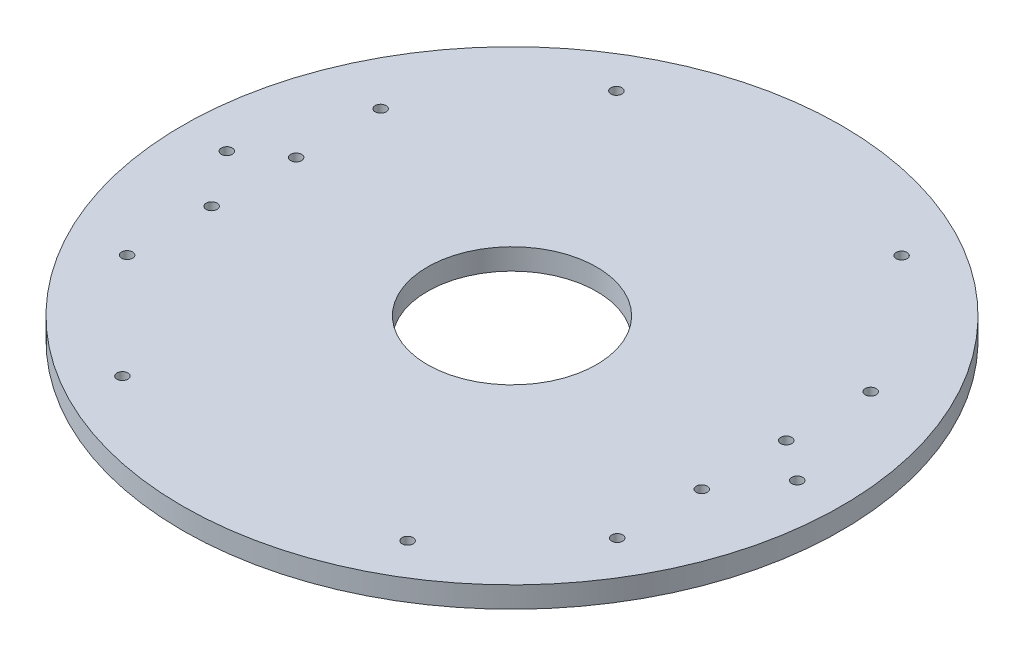
ISO-10303-21;
HEADER;
FILE_DESCRIPTION(('STEP AP214'),'2;1');
FILE_NAME('part.step','',(''),(''),'','','');
FILE_SCHEMA(('AUTOMOTIVE_DESIGN { 1 0 10303 214 1 1 1 1 }'));
ENDSEC;
DATA;
#1=APPLICATION_CONTEXT('core data for automotive mechanical design processes');
#2=APPLICATION_PROTOCOL_DEFINITION('international standard','automotive_design',2000,#1);
#3=PRODUCT_CONTEXT('',#1,'mechanical');
#4=PRODUCT('Part','Part','',(#3));
#5=PRODUCT_RELATED_PRODUCT_CATEGORY('part','',(#4));
#6=PRODUCT_DEFINITION_FORMATION('','',#4);
#7=PRODUCT_DEFINITION_CONTEXT('part definition',#1,'design');
#8=PRODUCT_DEFINITION('design','',#6,#7);
#9=PRODUCT_DEFINITION_SHAPE('','',#8);
#10=(LENGTH_UNIT() NAMED_UNIT(*) SI_UNIT(.MILLI.,.METRE.));
#11=(NAMED_UNIT(*) PLANE_ANGLE_UNIT() SI_UNIT($,.RADIAN.));
#12=(NAMED_UNIT(*) SI_UNIT($,.STERADIAN.) SOLID_ANGLE_UNIT());
#13=UNCERTAINTY_MEASURE_WITH_UNIT(LENGTH_MEASURE(1.E-05),#10,'distance_accuracy_value','');
#14=(GEOMETRIC_REPRESENTATION_CONTEXT(3) GLOBAL_UNCERTAINTY_ASSIGNED_CONTEXT((#13)) GLOBAL_UNIT_ASSIGNED_CONTEXT((#10,
#11,#12)) REPRESENTATION_CONTEXT('',''));
#15=CARTESIAN_POINT('',(0.,0.,0.));
#16=DIRECTION('',(0.,0.,1.));
#17=DIRECTION('',(1.,0.,0.));
#18=AXIS2_PLACEMENT_3D('',#15,#16,#17);
#19=CARTESIAN_POINT('',(0.,10.,0.));
#20=DIRECTION('',(0.,1.,0.));
#21=DIRECTION('',(0.,0.,1.));
#22=AXIS2_PLACEMENT_3D('',#19,#20,#21);
#23=PLANE('',#22);
#24=CARTESIAN_POINT('',(-67.5000000000013,10.,-116.913429510898));
#25=DIRECTION('',(0.,1.,0.));
#26=DIRECTION('',(-0.866025403784433,0.,0.50000000000001));
#27=AXIS2_PLACEMENT_3D('',#24,#25,#26);
#28=CIRCLE('',#27,2.59999999999999);
#29=CARTESIAN_POINT('',(-69.7516660498408,10.,-115.613429510898));
#30=VERTEX_POINT('',#29);
#31=EDGE_CURVE('E140',#30,#30,#28,.T.);
#32=ORIENTED_EDGE('',*,*,#31,.F.);
#33=EDGE_LOOP('',(#32));
#34=FACE_BOUND('',#33,.T.);
#35=CARTESIAN_POINT('',(67.4999999999988,10.,-116.9134295109));
#36=DIRECTION('',(0.,1.,0.));
#37=DIRECTION('',(-0.866025403784443,0.,-0.499999999999992));
#38=AXIS2_PLACEMENT_3D('',#35,#36,#37);
#39=CIRCLE('',#38,2.59999999999999);
#40=CARTESIAN_POINT('',(65.2483339501593,10.,-118.2134295109));
#41=VERTEX_POINT('',#40);
#42=EDGE_CURVE('E148',#41,#41,#39,.T.);
#43=ORIENTED_EDGE('',*,*,#42,.F.);
#44=EDGE_LOOP('',(#43));
#45=FACE_BOUND('',#44,.T.);
#46=CARTESIAN_POINT('',(135.,10.,0.));
#47=DIRECTION('',(0.,1.,0.));
#48=DIRECTION('',(0.,0.,-1.));
#49=AXIS2_PLACEMENT_3D('',#46,#47,#48);
#50=CIRCLE('',#49,2.59999999999999);
#51=CARTESIAN_POINT('',(135.,10.,-2.59999999999999));
#52=VERTEX_POINT('',#51);
#53=EDGE_CURVE('E156',#52,#52,#50,.T.);
#54=ORIENTED_EDGE('',*,*,#53,.F.);
#55=EDGE_LOOP('',(#54));
#56=FACE_BOUND('',#55,.T.);
#57=CARTESIAN_POINT('',(67.5000000000005,10.,116.913429510899));
#58=DIRECTION('',(0.,1.,0.));
#59=DIRECTION('',(0.866025403784436,0.,-0.500000000000004));
#60=AXIS2_PLACEMENT_3D('',#57,#58,#59);
#61=CIRCLE('',#60,2.59999999999999);
#62=CARTESIAN_POINT('',(69.75166604984,10.,115.613429510899));
#63=VERTEX_POINT('',#62);
#64=EDGE_CURVE('E164',#63,#63,#61,.T.);
#65=ORIENTED_EDGE('',*,*,#64,.F.);
#66=EDGE_LOOP('',(#65));
#67=FACE_BOUND('',#66,.T.);
#68=CARTESIAN_POINT('',(-67.4999999999996,10.,116.913429510899));
#69=DIRECTION('',(0.,1.,0.));
#70=DIRECTION('',(0.86602540378444,0.,0.499999999999998));
#71=AXIS2_PLACEMENT_3D('',#68,#69,#70);
#72=CIRCLE('',#71,2.59999999999999);
#73=CARTESIAN_POINT('',(-65.2483339501601,10.,118.213429510899));
#74=VERTEX_POINT('',#73);
#75=EDGE_CURVE('E132',#74,#74,#72,.T.);
#76=ORIENTED_EDGE('',*,*,#75,.F.);
#77=EDGE_LOOP('',(#76));
#78=FACE_BOUND('',#77,.T.);
#79=CARTESIAN_POINT('',(-135.,10.,0.));
#80=DIRECTION('',(0.,1.,0.));
#81=DIRECTION('',(0.,0.,1.));
#82=AXIS2_PLACEMENT_3D('',#79,#80,#81);
#83=CIRCLE('',#82,2.59999999999999);
#84=CARTESIAN_POINT('',(-135.,10.,2.59999999999999));
#85=VERTEX_POINT('',#84);
#86=EDGE_CURVE('E124',#85,#85,#83,.T.);
#87=ORIENTED_EDGE('',*,*,#86,.F.);
#88=EDGE_LOOP('',(#87));
#89=FACE_BOUND('',#88,.T.);
#90=CARTESIAN_POINT('',(0.,10.,0.));
#91=DIRECTION('',(0.,1.,0.));
#92=DIRECTION('',(0.,0.,1.));
#93=AXIS2_PLACEMENT_3D('',#90,#91,#92);
#94=CIRCLE('',#93,40.05);
#95=CARTESIAN_POINT('',(0.,10.,40.05));
#96=VERTEX_POINT('',#95);
#97=EDGE_CURVE('E116',#96,#96,#94,.T.);
#98=ORIENTED_EDGE('',*,*,#97,.F.);
#99=EDGE_LOOP('',(#98));
#100=FACE_BOUND('',#99,.T.);
#101=CARTESIAN_POINT('',(116.,10.,66.2));
#102=DIRECTION('',(0.,1.,0.));
#103=DIRECTION('',(0.,0.,1.));
#104=AXIS2_PLACEMENT_3D('',#101,#102,#103);
#105=CIRCLE('',#104,2.6);
#106=CARTESIAN_POINT('',(116.,10.,68.8));
#107=VERTEX_POINT('',#106);
#108=EDGE_CURVE('E56',#107,#107,#105,.T.);
#109=ORIENTED_EDGE('',*,*,#108,.F.);
#110=EDGE_LOOP('',(#109));
#111=FACE_BOUND('',#110,.T.);
#112=CARTESIAN_POINT('',(116.,10.,-13.8));
#113=DIRECTION('',(0.,1.,0.));
#114=DIRECTION('',(0.,0.,1.));
#115=AXIS2_PLACEMENT_3D('',#112,#113,#114);
#116=CIRCLE('',#115,2.60000000000006);
#117=CARTESIAN_POINT('',(116.,10.,-11.1999999999999));
#118=VERTEX_POINT('',#117);
#119=EDGE_CURVE('E81',#118,#118,#116,.T.);
#120=ORIENTED_EDGE('',*,*,#119,.F.);
#121=EDGE_LOOP('',(#120));
#122=FACE_BOUND('',#121,.T.);
#123=CARTESIAN_POINT('',(116.,10.,-53.8));
#124=DIRECTION('',(0.,1.,0.));
#125=DIRECTION('',(0.,0.,1.));
#126=AXIS2_PLACEMENT_3D('',#123,#124,#125);
#127=CIRCLE('',#126,2.6);
#128=CARTESIAN_POINT('',(116.,10.,-51.2));
#129=VERTEX_POINT('',#128);
#130=EDGE_CURVE('E73',#129,#129,#127,.T.);
#131=ORIENTED_EDGE('',*,*,#130,.F.);
#132=EDGE_LOOP('',(#131));
#133=FACE_BOUND('',#132,.T.);
#134=CARTESIAN_POINT('',(-116.,10.,-13.8));
#135=DIRECTION('',(0.,-1.,0.));
#136=DIRECTION('',(0.,0.,-1.));
#137=AXIS2_PLACEMENT_3D('',#134,#135,#136);
#138=CIRCLE('',#137,2.6);
#139=CARTESIAN_POINT('',(-116.,10.,-16.4));
#140=VERTEX_POINT('',#139);
#141=EDGE_CURVE('E65',#140,#140,#138,.T.);
#142=ORIENTED_EDGE('',*,*,#141,.T.);
#143=EDGE_LOOP('',(#142));
#144=FACE_BOUND('',#143,.T.);
#145=CARTESIAN_POINT('',(-116.,10.,66.2));
#146=DIRECTION('',(0.,-1.,0.));
#147=DIRECTION('',(0.,0.,-1.));
#148=AXIS2_PLACEMENT_3D('',#145,#146,#147);
#149=CIRCLE('',#148,2.6);
#150=CARTESIAN_POINT('',(-116.,10.,63.6));
#151=VERTEX_POINT('',#150);
#152=EDGE_CURVE('E96',#151,#151,#149,.T.);
#153=ORIENTED_EDGE('',*,*,#152,.T.);
#154=EDGE_LOOP('',(#153));
#155=FACE_BOUND('',#154,.T.);
#156=CARTESIAN_POINT('',(116.,10.,26.2));
#157=DIRECTION('',(0.,1.,0.));
#158=DIRECTION('',(0.,0.,1.));
#159=AXIS2_PLACEMENT_3D('',#156,#157,#158);
#160=CIRCLE('',#159,2.6);
#161=CARTESIAN_POINT('',(116.,10.,28.8));
#162=VERTEX_POINT('',#161);
#163=EDGE_CURVE('E52',#162,#162,#160,.T.);
#164=ORIENTED_EDGE('',*,*,#163,.F.);
#165=EDGE_LOOP('',(#164));
#166=FACE_BOUND('',#165,.T.);
#167=CARTESIAN_POINT('',(0.,10.,0.));
#168=DIRECTION('',(0.,1.,0.));
#169=DIRECTION('',(0.,0.,1.));
#170=AXIS2_PLACEMENT_3D('',#167,#168,#169);
#171=CIRCLE('',#170,156.);
#172=CARTESIAN_POINT('',(0.,10.,156.));
#173=VERTEX_POINT('',#172);
#174=EDGE_CURVE('E10',#173,#173,#171,.T.);
#175=ORIENTED_EDGE('',*,*,#174,.T.);
#176=EDGE_LOOP('',(#175));
#177=FACE_BOUND('',#176,.T.);
#178=CARTESIAN_POINT('',(-116.,10.,26.2));
#179=DIRECTION('',(0.,-1.,0.));
#180=DIRECTION('',(0.,0.,-1.));
#181=AXIS2_PLACEMENT_3D('',#178,#179,#180);
#182=CIRCLE('',#181,2.6);
#183=CARTESIAN_POINT('',(-116.,10.,23.6));
#184=VERTEX_POINT('',#183);
#185=EDGE_CURVE('E105',#184,#184,#182,.T.);
#186=ORIENTED_EDGE('',*,*,#185,.T.);
#187=EDGE_LOOP('',(#186));
#188=FACE_BOUND('',#187,.T.);
#189=CARTESIAN_POINT('',(-116.,10.,-53.8));
#190=DIRECTION('',(0.,-1.,0.));
#191=DIRECTION('',(0.,0.,-1.));
#192=AXIS2_PLACEMENT_3D('',#189,#190,#191);
#193=CIRCLE('',#192,2.6);
#194=CARTESIAN_POINT('',(-116.,10.,-56.4));
#195=VERTEX_POINT('',#194);
#196=EDGE_CURVE('E64',#195,#195,#193,.T.);
#197=ORIENTED_EDGE('',*,*,#196,.T.);
#198=EDGE_LOOP('',(#197));
#199=FACE_BOUND('',#198,.T.);
#200=ADVANCED_FACE('F37',(#34,#45,#56,#67,#78,#89,#100,#111,#122,#133,#144,#155,#166,#177,#188,
#199),#23,.T.);
#201=CARTESIAN_POINT('',(0.,0.,0.));
#202=DIRECTION('',(0.,1.,0.));
#203=DIRECTION('',(0.,0.,1.));
#204=AXIS2_PLACEMENT_3D('',#201,#202,#203);
#205=PLANE('',#204);
#206=CARTESIAN_POINT('',(-67.5000000000013,0.,-116.913429510898));
#207=DIRECTION('',(0.,1.,0.));
#208=DIRECTION('',(-0.866025403784433,0.,0.50000000000001));
#209=AXIS2_PLACEMENT_3D('',#206,#207,#208);
#210=CIRCLE('',#209,2.59999999999999);
#211=CARTESIAN_POINT('',(-69.7516660498408,0.,-115.613429510898));
#212=VERTEX_POINT('',#211);
#213=EDGE_CURVE('E144',#212,#212,#210,.T.);
#214=ORIENTED_EDGE('',*,*,#213,.T.);
#215=EDGE_LOOP('',(#214));
#216=FACE_BOUND('',#215,.T.);
#217=CARTESIAN_POINT('',(67.4999999999988,0.,-116.9134295109));
#218=DIRECTION('',(0.,1.,0.));
#219=DIRECTION('',(-0.866025403784443,0.,-0.499999999999992));
#220=AXIS2_PLACEMENT_3D('',#217,#218,#219);
#221=CIRCLE('',#220,2.59999999999999);
#222=CARTESIAN_POINT('',(65.2483339501593,0.,-118.2134295109));
#223=VERTEX_POINT('',#222);
#224=EDGE_CURVE('E152',#223,#223,#221,.T.);
#225=ORIENTED_EDGE('',*,*,#224,.T.);
#226=EDGE_LOOP('',(#225));
#227=FACE_BOUND('',#226,.T.);
#228=CARTESIAN_POINT('',(135.,0.,0.));
#229=DIRECTION('',(0.,1.,0.));
#230=DIRECTION('',(0.,0.,-1.));
#231=AXIS2_PLACEMENT_3D('',#228,#229,#230);
#232=CIRCLE('',#231,2.59999999999999);
#233=CARTESIAN_POINT('',(135.,0.,-2.59999999999999));
#234=VERTEX_POINT('',#233);
#235=EDGE_CURVE('E160',#234,#234,#232,.T.);
#236=ORIENTED_EDGE('',*,*,#235,.T.);
#237=EDGE_LOOP('',(#236));
#238=FACE_BOUND('',#237,.T.);
#239=CARTESIAN_POINT('',(67.5000000000005,0.,116.913429510899));
#240=DIRECTION('',(0.,1.,0.));
#241=DIRECTION('',(0.866025403784436,0.,-0.500000000000004));
#242=AXIS2_PLACEMENT_3D('',#239,#240,#241);
#243=CIRCLE('',#242,2.59999999999999);
#244=CARTESIAN_POINT('',(69.75166604984,0.,115.613429510899));
#245=VERTEX_POINT('',#244);
#246=EDGE_CURVE('E136',#245,#245,#243,.T.);
#247=ORIENTED_EDGE('',*,*,#246,.T.);
#248=EDGE_LOOP('',(#247));
#249=FACE_BOUND('',#248,.T.);
#250=CARTESIAN_POINT('',(-67.4999999999996,0.,116.913429510899));
#251=DIRECTION('',(0.,1.,0.));
#252=DIRECTION('',(0.86602540378444,0.,0.499999999999998));
#253=AXIS2_PLACEMENT_3D('',#250,#251,#252);
#254=CIRCLE('',#253,2.59999999999999);
#255=CARTESIAN_POINT('',(-65.2483339501601,0.,118.213429510899));
#256=VERTEX_POINT('',#255);
#257=EDGE_CURVE('E128',#256,#256,#254,.T.);
#258=ORIENTED_EDGE('',*,*,#257,.T.);
#259=EDGE_LOOP('',(#258));
#260=FACE_BOUND('',#259,.T.);
#261=CARTESIAN_POINT('',(-135.,0.,0.));
#262=DIRECTION('',(0.,1.,0.));
#263=DIRECTION('',(0.,0.,1.));
#264=AXIS2_PLACEMENT_3D('',#261,#262,#263);
#265=CIRCLE('',#264,2.59999999999999);
#266=CARTESIAN_POINT('',(-135.,0.,2.59999999999999));
#267=VERTEX_POINT('',#266);
#268=EDGE_CURVE('E120',#267,#267,#265,.T.);
#269=ORIENTED_EDGE('',*,*,#268,.T.);
#270=EDGE_LOOP('',(#269));
#271=FACE_BOUND('',#270,.T.);
#272=CARTESIAN_POINT('',(0.,0.,0.));
#273=DIRECTION('',(0.,1.,0.));
#274=DIRECTION('',(0.,0.,1.));
#275=AXIS2_PLACEMENT_3D('',#272,#273,#274);
#276=CIRCLE('',#275,40.05);
#277=CARTESIAN_POINT('',(0.,0.,40.05));
#278=VERTEX_POINT('',#277);
#279=EDGE_CURVE('E97',#278,#278,#276,.T.);
#280=ORIENTED_EDGE('',*,*,#279,.T.);
#281=EDGE_LOOP('',(#280));
#282=FACE_BOUND('',#281,.T.);
#283=CARTESIAN_POINT('',(116.,0.,66.2));
#284=DIRECTION('',(0.,1.,0.));
#285=DIRECTION('',(0.,0.,1.));
#286=AXIS2_PLACEMENT_3D('',#283,#284,#285);
#287=CIRCLE('',#286,2.6);
#288=CARTESIAN_POINT('',(116.,0.,68.8));
#289=VERTEX_POINT('',#288);
#290=EDGE_CURVE('E85',#289,#289,#287,.T.);
#291=ORIENTED_EDGE('',*,*,#290,.T.);
#292=EDGE_LOOP('',(#291));
#293=FACE_BOUND('',#292,.T.);
#294=CARTESIAN_POINT('',(116.,0.,-13.8));
#295=DIRECTION('',(0.,1.,0.));
#296=DIRECTION('',(0.,0.,1.));
#297=AXIS2_PLACEMENT_3D('',#294,#295,#296);
#298=CIRCLE('',#297,2.60000000000006);
#299=CARTESIAN_POINT('',(116.,0.,-11.1999999999999));
#300=VERTEX_POINT('',#299);
#301=EDGE_CURVE('E77',#300,#300,#298,.T.);
#302=ORIENTED_EDGE('',*,*,#301,.T.);
#303=EDGE_LOOP('',(#302));
#304=FACE_BOUND('',#303,.T.);
#305=CARTESIAN_POINT('',(116.,0.,-53.8));
#306=DIRECTION('',(0.,1.,0.));
#307=DIRECTION('',(0.,0.,1.));
#308=AXIS2_PLACEMENT_3D('',#305,#306,#307);
#309=CIRCLE('',#308,2.6);
#310=CARTESIAN_POINT('',(116.,0.,-51.2));
#311=VERTEX_POINT('',#310);
#312=EDGE_CURVE('E69',#311,#311,#309,.T.);
#313=ORIENTED_EDGE('',*,*,#312,.T.);
#314=EDGE_LOOP('',(#313));
#315=FACE_BOUND('',#314,.T.);
#316=CARTESIAN_POINT('',(116.,0.,26.2));
#317=DIRECTION('',(0.,1.,0.));
#318=DIRECTION('',(0.,0.,1.));
#319=AXIS2_PLACEMENT_3D('',#316,#317,#318);
#320=CIRCLE('',#319,2.6);
#321=CARTESIAN_POINT('',(116.,0.,28.8));
#322=VERTEX_POINT('',#321);
#323=EDGE_CURVE('E50',#322,#322,#320,.T.);
#324=ORIENTED_EDGE('',*,*,#323,.T.);
#325=EDGE_LOOP('',(#324));
#326=FACE_BOUND('',#325,.T.);
#327=CARTESIAN_POINT('',(0.,0.,0.));
#328=DIRECTION('',(0.,1.,0.));
#329=DIRECTION('',(0.,0.,1.));
#330=AXIS2_PLACEMENT_3D('',#327,#328,#329);
#331=CIRCLE('',#330,156.);
#332=CARTESIAN_POINT('',(0.,0.,156.));
#333=VERTEX_POINT('',#332);
#334=EDGE_CURVE('E41',#333,#333,#331,.T.);
#335=ORIENTED_EDGE('',*,*,#334,.F.);
#336=EDGE_LOOP('',(#335));
#337=FACE_BOUND('',#336,.T.);
#338=CARTESIAN_POINT('',(-116.,0.,66.2));
#339=DIRECTION('',(0.,-1.,0.));
#340=DIRECTION('',(0.,0.,-1.));
#341=AXIS2_PLACEMENT_3D('',#338,#339,#340);
#342=CIRCLE('',#341,2.6);
#343=CARTESIAN_POINT('',(-116.,0.,63.6));
#344=VERTEX_POINT('',#343);
#345=EDGE_CURVE('E92',#344,#344,#342,.T.);
#346=ORIENTED_EDGE('',*,*,#345,.F.);
#347=EDGE_LOOP('',(#346));
#348=FACE_BOUND('',#347,.T.);
#349=CARTESIAN_POINT('',(-116.,0.,26.2));
#350=DIRECTION('',(0.,-1.,0.));
#351=DIRECTION('',(0.,0.,-1.));
#352=AXIS2_PLACEMENT_3D('',#349,#350,#351);
#353=CIRCLE('',#352,2.6);
#354=CARTESIAN_POINT('',(-116.,0.,23.6));
#355=VERTEX_POINT('',#354);
#356=EDGE_CURVE('E101',#355,#355,#353,.T.);
#357=ORIENTED_EDGE('',*,*,#356,.F.);
#358=EDGE_LOOP('',(#357));
#359=FACE_BOUND('',#358,.T.);
#360=CARTESIAN_POINT('',(-116.,0.,-13.8));
#361=DIRECTION('',(0.,-1.,0.));
#362=DIRECTION('',(0.,0.,-1.));
#363=AXIS2_PLACEMENT_3D('',#360,#361,#362);
#364=CIRCLE('',#363,2.6);
#365=CARTESIAN_POINT('',(-116.,0.,-16.4));
#366=VERTEX_POINT('',#365);
#367=EDGE_CURVE('E109',#366,#366,#364,.T.);
#368=ORIENTED_EDGE('',*,*,#367,.F.);
#369=EDGE_LOOP('',(#368));
#370=FACE_BOUND('',#369,.T.);
#371=CARTESIAN_POINT('',(-116.,0.,-53.8));
#372=DIRECTION('',(0.,-1.,0.));
#373=DIRECTION('',(0.,0.,-1.));
#374=AXIS2_PLACEMENT_3D('',#371,#372,#373);
#375=CIRCLE('',#374,2.6);
#376=CARTESIAN_POINT('',(-116.,0.,-56.4));
#377=VERTEX_POINT('',#376);
#378=EDGE_CURVE('E60',#377,#377,#375,.T.);
#379=ORIENTED_EDGE('',*,*,#378,.F.);
#380=EDGE_LOOP('',(#379));
#381=FACE_BOUND('',#380,.T.);
#382=ADVANCED_FACE('F172',(#216,#227,#238,#249,#260,#271,#282,#293,#304,#315,#326,#337,#348,
#359,#370,#381),#205,.F.);
#383=CARTESIAN_POINT('',(0.,10.,0.));
#384=DIRECTION('',(0.,-1.,0.));
#385=DIRECTION('',(0.,0.,-1.));
#386=AXIS2_PLACEMENT_3D('',#383,#384,#385);
#387=CYLINDRICAL_SURFACE('',#386,156.);
#388=ORIENTED_EDGE('',*,*,#174,.F.);
#389=EDGE_LOOP('',(#388));
#390=FACE_BOUND('',#389,.T.);
#391=ORIENTED_EDGE('',*,*,#334,.T.);
#392=EDGE_LOOP('',(#391));
#393=FACE_BOUND('',#392,.T.);
#394=ADVANCED_FACE('F39',(#390,#393),#387,.T.);
#395=CARTESIAN_POINT('',(116.,0.,26.2));
#396=DIRECTION('',(0.,1.,0.));
#397=DIRECTION('',(0.,0.,1.));
#398=AXIS2_PLACEMENT_3D('',#395,#396,#397);
#399=CYLINDRICAL_SURFACE('',#398,2.6);
#400=ORIENTED_EDGE('',*,*,#323,.F.);
#401=EDGE_LOOP('',(#400));
#402=FACE_BOUND('',#401,.T.);
#403=ORIENTED_EDGE('',*,*,#163,.T.);
#404=EDGE_LOOP('',(#403));
#405=FACE_BOUND('',#404,.T.);
#406=ADVANCED_FACE('F227',(#402,#405),#399,.F.);
#407=CARTESIAN_POINT('',(-116.,0.,66.2));
#408=DIRECTION('',(0.,1.,0.));
#409=DIRECTION('',(0.,0.,1.));
#410=AXIS2_PLACEMENT_3D('',#407,#408,#409);
#411=CYLINDRICAL_SURFACE('',#410,2.6);
#412=ORIENTED_EDGE('',*,*,#345,.T.);
#413=EDGE_LOOP('',(#412));
#414=FACE_BOUND('',#413,.T.);
#415=ORIENTED_EDGE('',*,*,#152,.F.);
#416=EDGE_LOOP('',(#415));
#417=FACE_BOUND('',#416,.T.);
#418=ADVANCED_FACE('F229',(#414,#417),#411,.F.);
#419=CARTESIAN_POINT('',(-116.,0.,26.2));
#420=DIRECTION('',(0.,1.,0.));
#421=DIRECTION('',(0.,0.,1.));
#422=AXIS2_PLACEMENT_3D('',#419,#420,#421);
#423=CYLINDRICAL_SURFACE('',#422,2.6);
#424=ORIENTED_EDGE('',*,*,#356,.T.);
#425=EDGE_LOOP('',(#424));
#426=FACE_BOUND('',#425,.T.);
#427=ORIENTED_EDGE('',*,*,#185,.F.);
#428=EDGE_LOOP('',(#427));
#429=FACE_BOUND('',#428,.T.);
#430=ADVANCED_FACE('F222',(#426,#429),#423,.F.);
#431=CARTESIAN_POINT('',(-116.,0.,-13.8));
#432=DIRECTION('',(0.,1.,0.));
#433=DIRECTION('',(0.,0.,1.));
#434=AXIS2_PLACEMENT_3D('',#431,#432,#433);
#435=CYLINDRICAL_SURFACE('',#434,2.6);
#436=ORIENTED_EDGE('',*,*,#367,.T.);
#437=EDGE_LOOP('',(#436));
#438=FACE_BOUND('',#437,.T.);
#439=ORIENTED_EDGE('',*,*,#141,.F.);
#440=EDGE_LOOP('',(#439));
#441=FACE_BOUND('',#440,.T.);
#442=ADVANCED_FACE('F212',(#438,#441),#435,.F.);
#443=CARTESIAN_POINT('',(-116.,0.,-53.8));
#444=DIRECTION('',(0.,1.,0.));
#445=DIRECTION('',(0.,0.,1.));
#446=AXIS2_PLACEMENT_3D('',#443,#444,#445);
#447=CYLINDRICAL_SURFACE('',#446,2.6);
#448=ORIENTED_EDGE('',*,*,#378,.T.);
#449=EDGE_LOOP('',(#448));
#450=FACE_BOUND('',#449,.T.);
#451=ORIENTED_EDGE('',*,*,#196,.F.);
#452=EDGE_LOOP('',(#451));
#453=FACE_BOUND('',#452,.T.);
#454=ADVANCED_FACE('F209',(#450,#453),#447,.F.);
#455=CARTESIAN_POINT('',(116.,0.,-53.8));
#456=DIRECTION('',(0.,1.,0.));
#457=DIRECTION('',(0.,0.,1.));
#458=AXIS2_PLACEMENT_3D('',#455,#456,#457);
#459=CYLINDRICAL_SURFACE('',#458,2.6);
#460=ORIENTED_EDGE('',*,*,#312,.F.);
#461=EDGE_LOOP('',(#460));
#462=FACE_BOUND('',#461,.T.);
#463=ORIENTED_EDGE('',*,*,#130,.T.);
#464=EDGE_LOOP('',(#463));
#465=FACE_BOUND('',#464,.T.);
#466=ADVANCED_FACE('F211',(#462,#465),#459,.F.);
#467=CARTESIAN_POINT('',(116.,0.,-13.8));
#468=DIRECTION('',(0.,1.,0.));
#469=DIRECTION('',(0.,0.,1.));
#470=AXIS2_PLACEMENT_3D('',#467,#468,#469);
#471=CYLINDRICAL_SURFACE('',#470,2.60000000000006);
#472=ORIENTED_EDGE('',*,*,#301,.F.);
#473=EDGE_LOOP('',(#472));
#474=FACE_BOUND('',#473,.T.);
#475=ORIENTED_EDGE('',*,*,#119,.T.);
#476=EDGE_LOOP('',(#475));
#477=FACE_BOUND('',#476,.T.);
#478=ADVANCED_FACE('F219',(#474,#477),#471,.F.);
#479=CARTESIAN_POINT('',(116.,0.,66.2));
#480=DIRECTION('',(0.,1.,0.));
#481=DIRECTION('',(0.,0.,1.));
#482=AXIS2_PLACEMENT_3D('',#479,#480,#481);
#483=CYLINDRICAL_SURFACE('',#482,2.6);
#484=ORIENTED_EDGE('',*,*,#290,.F.);
#485=EDGE_LOOP('',(#484));
#486=FACE_BOUND('',#485,.T.);
#487=ORIENTED_EDGE('',*,*,#108,.T.);
#488=EDGE_LOOP('',(#487));
#489=FACE_BOUND('',#488,.T.);
#490=ADVANCED_FACE('F268',(#486,#489),#483,.F.);
#491=CARTESIAN_POINT('',(0.,0.,0.));
#492=DIRECTION('',(0.,1.,0.));
#493=DIRECTION('',(0.,0.,1.));
#494=AXIS2_PLACEMENT_3D('',#491,#492,#493);
#495=CYLINDRICAL_SURFACE('',#494,40.05);
#496=ORIENTED_EDGE('',*,*,#279,.F.);
#497=EDGE_LOOP('',(#496));
#498=FACE_BOUND('',#497,.T.);
#499=ORIENTED_EDGE('',*,*,#97,.T.);
#500=EDGE_LOOP('',(#499));
#501=FACE_BOUND('',#500,.T.);
#502=ADVANCED_FACE('F265',(#498,#501),#495,.F.);
#503=CARTESIAN_POINT('',(-135.,0.,0.));
#504=DIRECTION('',(0.,1.,0.));
#505=DIRECTION('',(0.,0.,1.));
#506=AXIS2_PLACEMENT_3D('',#503,#504,#505);
#507=CYLINDRICAL_SURFACE('',#506,2.59999999999999);
#508=ORIENTED_EDGE('',*,*,#268,.F.);
#509=EDGE_LOOP('',(#508));
#510=FACE_BOUND('',#509,.T.);
#511=ORIENTED_EDGE('',*,*,#86,.T.);
#512=EDGE_LOOP('',(#511));
#513=FACE_BOUND('',#512,.T.);
#514=ADVANCED_FACE('F261',(#510,#513),#507,.F.);
#515=CARTESIAN_POINT('',(-67.4999999999996,0.,116.913429510899));
#516=DIRECTION('',(0.,1.,0.));
#517=DIRECTION('',(0.,0.,1.));
#518=AXIS2_PLACEMENT_3D('',#515,#516,#517);
#519=CYLINDRICAL_SURFACE('',#518,2.59999999999999);
#520=ORIENTED_EDGE('',*,*,#257,.F.);
#521=EDGE_LOOP('',(#520));
#522=FACE_BOUND('',#521,.T.);
#523=ORIENTED_EDGE('',*,*,#75,.T.);
#524=EDGE_LOOP('',(#523));
#525=FACE_BOUND('',#524,.T.);
#526=ADVANCED_FACE('F179',(#522,#525),#519,.F.);
#527=CARTESIAN_POINT('',(67.5000000000005,0.,116.913429510899));
#528=DIRECTION('',(0.,1.,0.));
#529=DIRECTION('',(0.,0.,1.));
#530=AXIS2_PLACEMENT_3D('',#527,#528,#529);
#531=CYLINDRICAL_SURFACE('',#530,2.59999999999999);
#532=ORIENTED_EDGE('',*,*,#246,.F.);
#533=EDGE_LOOP('',(#532));
#534=FACE_BOUND('',#533,.T.);
#535=ORIENTED_EDGE('',*,*,#64,.T.);
#536=EDGE_LOOP('',(#535));
#537=FACE_BOUND('',#536,.T.);
#538=ADVANCED_FACE('F175',(#534,#537),#531,.F.);
#539=CARTESIAN_POINT('',(135.,0.,0.));
#540=DIRECTION('',(0.,1.,0.));
#541=DIRECTION('',(0.,0.,1.));
#542=AXIS2_PLACEMENT_3D('',#539,#540,#541);
#543=CYLINDRICAL_SURFACE('',#542,2.59999999999999);
#544=ORIENTED_EDGE('',*,*,#235,.F.);
#545=EDGE_LOOP('',(#544));
#546=FACE_BOUND('',#545,.T.);
#547=ORIENTED_EDGE('',*,*,#53,.T.);
#548=EDGE_LOOP('',(#547));
#549=FACE_BOUND('',#548,.T.);
#550=ADVANCED_FACE('F178',(#546,#549),#543,.F.);
#551=CARTESIAN_POINT('',(67.4999999999988,0.,-116.9134295109));
#552=DIRECTION('',(0.,1.,0.));
#553=DIRECTION('',(0.,0.,1.));
#554=AXIS2_PLACEMENT_3D('',#551,#552,#553);
#555=CYLINDRICAL_SURFACE('',#554,2.59999999999999);
#556=ORIENTED_EDGE('',*,*,#224,.F.);
#557=EDGE_LOOP('',(#556));
#558=FACE_BOUND('',#557,.T.);
#559=ORIENTED_EDGE('',*,*,#42,.T.);
#560=EDGE_LOOP('',(#559));
#561=FACE_BOUND('',#560,.T.);
#562=ADVANCED_FACE('F245',(#558,#561),#555,.F.);
#563=CARTESIAN_POINT('',(-67.5000000000013,0.,-116.913429510898));
#564=DIRECTION('',(0.,1.,0.));
#565=DIRECTION('',(0.,0.,1.));
#566=AXIS2_PLACEMENT_3D('',#563,#564,#565);
#567=CYLINDRICAL_SURFACE('',#566,2.59999999999999);
#568=ORIENTED_EDGE('',*,*,#213,.F.);
#569=EDGE_LOOP('',(#568));
#570=FACE_BOUND('',#569,.T.);
#571=ORIENTED_EDGE('',*,*,#31,.T.);
#572=EDGE_LOOP('',(#571));
#573=FACE_BOUND('',#572,.T.);
#574=ADVANCED_FACE('F252',(#570,#573),#567,.F.);
#575=CLOSED_SHELL('',(#200,#382,#394,#406,#418,#430,#442,#454,#466,#478,#490,#502,#514,#526,
#538,#550,#562,#574));
#576=MANIFOLD_SOLID_BREP('B2',#575);
#577=ADVANCED_BREP_SHAPE_REPRESENTATION('',(#18,#576),#14);
#578=SHAPE_DEFINITION_REPRESENTATION(#9,#577);
ENDSEC;
END-ISO-10303-21;
